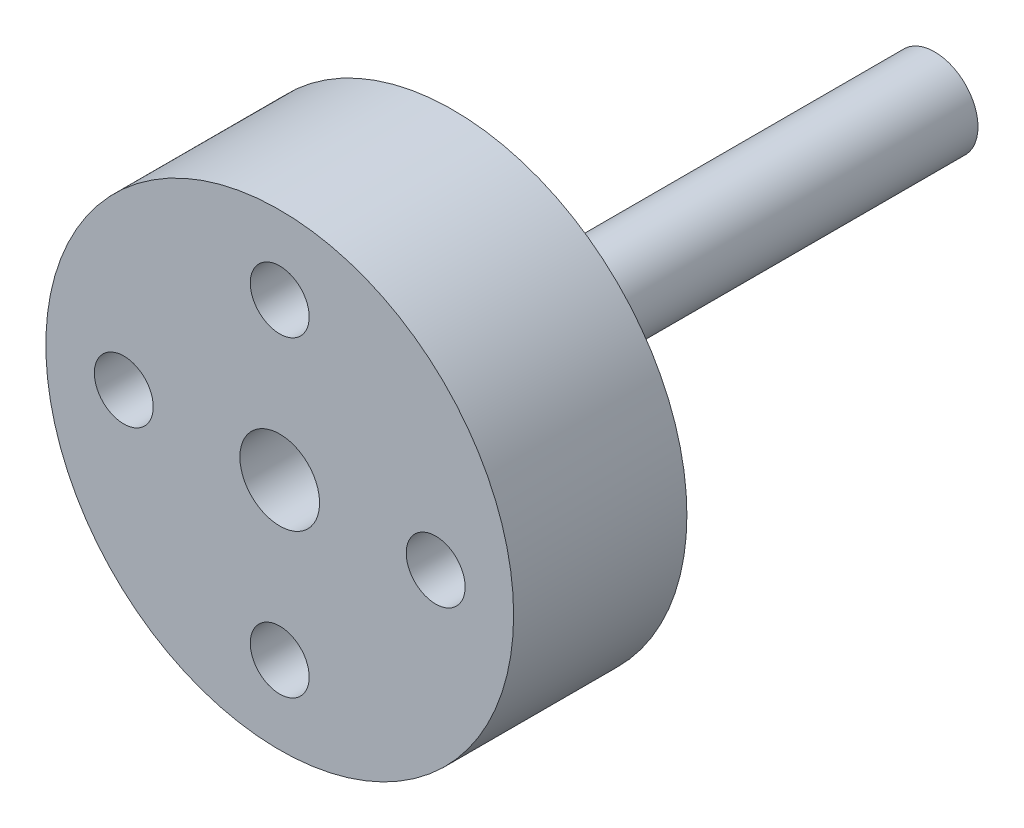
ISO-10303-21;
HEADER;
FILE_DESCRIPTION(('STEP AP214'),'2;1');
FILE_NAME('part.step','',(''),(''),'','','');
FILE_SCHEMA(('AUTOMOTIVE_DESIGN { 1 0 10303 214 1 1 1 1 }'));
ENDSEC;
DATA;
#1=APPLICATION_CONTEXT('core data for automotive mechanical design processes');
#2=APPLICATION_PROTOCOL_DEFINITION('international standard','automotive_design',2000,#1);
#3=PRODUCT_CONTEXT('',#1,'mechanical');
#4=PRODUCT('Part','Part','',(#3));
#5=PRODUCT_RELATED_PRODUCT_CATEGORY('part','',(#4));
#6=PRODUCT_DEFINITION_FORMATION('','',#4);
#7=PRODUCT_DEFINITION_CONTEXT('part definition',#1,'design');
#8=PRODUCT_DEFINITION('design','',#6,#7);
#9=PRODUCT_DEFINITION_SHAPE('','',#8);
#10=(LENGTH_UNIT() NAMED_UNIT(*) SI_UNIT(.MILLI.,.METRE.));
#11=(NAMED_UNIT(*) PLANE_ANGLE_UNIT() SI_UNIT($,.RADIAN.));
#12=(NAMED_UNIT(*) SI_UNIT($,.STERADIAN.) SOLID_ANGLE_UNIT());
#13=UNCERTAINTY_MEASURE_WITH_UNIT(LENGTH_MEASURE(1.E-05),#10,'distance_accuracy_value','');
#14=(GEOMETRIC_REPRESENTATION_CONTEXT(3) GLOBAL_UNCERTAINTY_ASSIGNED_CONTEXT((#13)) GLOBAL_UNIT_ASSIGNED_CONTEXT((#10,
#11,#12)) REPRESENTATION_CONTEXT('',''));
#15=CARTESIAN_POINT('',(0.,0.,0.));
#16=DIRECTION('',(0.,0.,1.));
#17=DIRECTION('',(1.,0.,0.));
#18=AXIS2_PLACEMENT_3D('',#15,#16,#17);
#19=CARTESIAN_POINT('',(0.,0.,0.));
#20=DIRECTION('',(0.,0.,-1.));
#21=DIRECTION('',(1.,0.,0.));
#22=AXIS2_PLACEMENT_3D('',#19,#20,#21);
#23=PLANE('',#22);
#24=CARTESIAN_POINT('',(9.,0.,0.));
#25=DIRECTION('',(0.,0.,1.));
#26=DIRECTION('',(1.,0.,0.));
#27=AXIS2_PLACEMENT_3D('',#24,#25,#26);
#28=CIRCLE('',#27,1.7);
#29=CARTESIAN_POINT('',(10.7,0.,0.));
#30=VERTEX_POINT('',#29);
#31=EDGE_CURVE('E81',#30,#30,#28,.F.);
#32=ORIENTED_EDGE('',*,*,#31,.T.);
#33=EDGE_LOOP('',(#32));
#34=FACE_BOUND('',#33,.T.);
#35=CARTESIAN_POINT('',(0.,0.,0.));
#36=DIRECTION('',(0.,0.,1.));
#37=DIRECTION('',(1.,0.,0.));
#38=AXIS2_PLACEMENT_3D('',#35,#36,#37);
#39=CIRCLE('',#38,13.5);
#40=CARTESIAN_POINT('',(13.5,0.,0.));
#41=VERTEX_POINT('',#40);
#42=EDGE_CURVE('E45',#41,#41,#39,.T.);
#43=ORIENTED_EDGE('',*,*,#42,.T.);
#44=EDGE_LOOP('',(#43));
#45=FACE_BOUND('',#44,.T.);
#46=CARTESIAN_POINT('',(0.,0.,0.));
#47=DIRECTION('',(0.,0.,-1.));
#48=DIRECTION('',(-1.,0.,0.));
#49=AXIS2_PLACEMENT_3D('',#46,#47,#48);
#50=CIRCLE('',#49,2.3);
#51=CARTESIAN_POINT('',(-2.3,0.,0.));
#52=VERTEX_POINT('',#51);
#53=EDGE_CURVE('E60',#52,#52,#50,.T.);
#54=ORIENTED_EDGE('',*,*,#53,.T.);
#55=EDGE_LOOP('',(#54));
#56=FACE_BOUND('',#55,.T.);
#57=CARTESIAN_POINT('',(0.,-9.,0.));
#58=DIRECTION('',(0.,0.,1.));
#59=DIRECTION('',(1.,0.,0.));
#60=AXIS2_PLACEMENT_3D('',#57,#58,#59);
#61=CIRCLE('',#60,1.7);
#62=CARTESIAN_POINT('',(1.7,-9.,0.));
#63=VERTEX_POINT('',#62);
#64=EDGE_CURVE('E63',#63,#63,#61,.F.);
#65=ORIENTED_EDGE('',*,*,#64,.T.);
#66=EDGE_LOOP('',(#65));
#67=FACE_BOUND('',#66,.T.);
#68=CARTESIAN_POINT('',(-9.,0.,0.));
#69=DIRECTION('',(0.,0.,1.));
#70=DIRECTION('',(1.,0.,0.));
#71=AXIS2_PLACEMENT_3D('',#68,#69,#70);
#72=CIRCLE('',#71,1.7);
#73=CARTESIAN_POINT('',(-7.3,0.,0.));
#74=VERTEX_POINT('',#73);
#75=EDGE_CURVE('E72',#74,#74,#72,.F.);
#76=ORIENTED_EDGE('',*,*,#75,.T.);
#77=EDGE_LOOP('',(#76));
#78=FACE_BOUND('',#77,.T.);
#79=CARTESIAN_POINT('',(0.,9.,0.));
#80=DIRECTION('',(0.,0.,1.));
#81=DIRECTION('',(1.,0.,0.));
#82=AXIS2_PLACEMENT_3D('',#79,#80,#81);
#83=CIRCLE('',#82,1.7);
#84=CARTESIAN_POINT('',(1.7,9.,0.));
#85=VERTEX_POINT('',#84);
#86=EDGE_CURVE('E90',#85,#85,#83,.F.);
#87=ORIENTED_EDGE('',*,*,#86,.T.);
#88=EDGE_LOOP('',(#87));
#89=FACE_BOUND('',#88,.T.);
#90=ADVANCED_FACE('F41',(#34,#45,#56,#67,#78,#89),#23,.F.);
#91=CARTESIAN_POINT('',(0.,0.,-10.));
#92=DIRECTION('',(0.,0.,1.));
#93=DIRECTION('',(-1.,0.,0.));
#94=AXIS2_PLACEMENT_3D('',#91,#92,#93);
#95=CYLINDRICAL_SURFACE('',#94,13.5);
#96=CARTESIAN_POINT('',(0.,0.,-10.));
#97=DIRECTION('',(0.,0.,1.));
#98=DIRECTION('',(1.,0.,0.));
#99=AXIS2_PLACEMENT_3D('',#96,#97,#98);
#100=CIRCLE('',#99,13.5);
#101=CARTESIAN_POINT('',(13.5,0.,-10.));
#102=VERTEX_POINT('',#101);
#103=EDGE_CURVE('E10',#102,#102,#100,.T.);
#104=ORIENTED_EDGE('',*,*,#103,.T.);
#105=EDGE_LOOP('',(#104));
#106=FACE_BOUND('',#105,.T.);
#107=ORIENTED_EDGE('',*,*,#42,.F.);
#108=EDGE_LOOP('',(#107));
#109=FACE_BOUND('',#108,.T.);
#110=ADVANCED_FACE('F43',(#106,#109),#95,.T.);
#111=CARTESIAN_POINT('',(0.,0.,-10.));
#112=DIRECTION('',(0.,0.,-1.));
#113=DIRECTION('',(1.,0.,0.));
#114=AXIS2_PLACEMENT_3D('',#111,#112,#113);
#115=PLANE('',#114);
#116=CARTESIAN_POINT('',(0.,9.,-10.));
#117=DIRECTION('',(0.,0.,1.));
#118=DIRECTION('',(1.,0.,0.));
#119=AXIS2_PLACEMENT_3D('',#116,#117,#118);
#120=CIRCLE('',#119,3.15);
#121=CARTESIAN_POINT('',(3.15,9.,-10.));
#122=VERTEX_POINT('',#121);
#123=EDGE_CURVE('E96',#122,#122,#120,.T.);
#124=ORIENTED_EDGE('',*,*,#123,.T.);
#125=EDGE_LOOP('',(#124));
#126=FACE_BOUND('',#125,.T.);
#127=CARTESIAN_POINT('',(9.,0.,-10.));
#128=DIRECTION('',(0.,0.,1.));
#129=DIRECTION('',(1.,0.,0.));
#130=AXIS2_PLACEMENT_3D('',#127,#128,#129);
#131=CIRCLE('',#130,3.15);
#132=CARTESIAN_POINT('',(12.15,0.,-10.));
#133=VERTEX_POINT('',#132);
#134=EDGE_CURVE('E87',#133,#133,#131,.T.);
#135=ORIENTED_EDGE('',*,*,#134,.T.);
#136=EDGE_LOOP('',(#135));
#137=FACE_BOUND('',#136,.T.);
#138=CARTESIAN_POINT('',(-9.,0.,-10.));
#139=DIRECTION('',(0.,0.,1.));
#140=DIRECTION('',(1.,0.,0.));
#141=AXIS2_PLACEMENT_3D('',#138,#139,#140);
#142=CIRCLE('',#141,3.15);
#143=CARTESIAN_POINT('',(-5.85,0.,-10.));
#144=VERTEX_POINT('',#143);
#145=EDGE_CURVE('E78',#144,#144,#142,.T.);
#146=ORIENTED_EDGE('',*,*,#145,.T.);
#147=EDGE_LOOP('',(#146));
#148=FACE_BOUND('',#147,.T.);
#149=CARTESIAN_POINT('',(0.,-9.,-10.));
#150=DIRECTION('',(0.,0.,1.));
#151=DIRECTION('',(1.,0.,0.));
#152=AXIS2_PLACEMENT_3D('',#149,#150,#151);
#153=CIRCLE('',#152,3.15);
#154=CARTESIAN_POINT('',(3.15,-9.,-10.));
#155=VERTEX_POINT('',#154);
#156=EDGE_CURVE('E69',#155,#155,#153,.T.);
#157=ORIENTED_EDGE('',*,*,#156,.T.);
#158=EDGE_LOOP('',(#157));
#159=FACE_BOUND('',#158,.T.);
#160=CARTESIAN_POINT('',(0.,0.,-10.));
#161=DIRECTION('',(0.,0.,1.));
#162=DIRECTION('',(1.,0.,0.));
#163=AXIS2_PLACEMENT_3D('',#160,#161,#162);
#164=CIRCLE('',#163,2.5);
#165=CARTESIAN_POINT('',(2.5,0.,-10.));
#166=VERTEX_POINT('',#165);
#167=EDGE_CURVE('E54',#166,#166,#164,.T.);
#168=ORIENTED_EDGE('',*,*,#167,.T.);
#169=EDGE_LOOP('',(#168));
#170=FACE_BOUND('',#169,.T.);
#171=ORIENTED_EDGE('',*,*,#103,.F.);
#172=EDGE_LOOP('',(#171));
#173=FACE_BOUND('',#172,.T.);
#174=ADVANCED_FACE('F116',(#126,#137,#148,#159,#170,#173),#115,.T.);
#175=CARTESIAN_POINT('',(0.,0.,-37.8));
#176=DIRECTION('',(0.,0.,1.));
#177=DIRECTION('',(-1.,0.,0.));
#178=AXIS2_PLACEMENT_3D('',#175,#176,#177);
#179=CYLINDRICAL_SURFACE('',#178,2.5);
#180=CARTESIAN_POINT('',(0.,0.,-37.8));
#181=DIRECTION('',(0.,0.,1.));
#182=DIRECTION('',(1.,0.,0.));
#183=AXIS2_PLACEMENT_3D('',#180,#181,#182);
#184=CIRCLE('',#183,2.5);
#185=CARTESIAN_POINT('',(2.5,0.,-37.8));
#186=VERTEX_POINT('',#185);
#187=EDGE_CURVE('E52',#186,#186,#184,.T.);
#188=ORIENTED_EDGE('',*,*,#187,.T.);
#189=EDGE_LOOP('',(#188));
#190=FACE_BOUND('',#189,.T.);
#191=ORIENTED_EDGE('',*,*,#167,.F.);
#192=EDGE_LOOP('',(#191));
#193=FACE_BOUND('',#192,.T.);
#194=ADVANCED_FACE('F119',(#190,#193),#179,.T.);
#195=CARTESIAN_POINT('',(0.,0.,-37.8));
#196=DIRECTION('',(0.,0.,-1.));
#197=DIRECTION('',(1.,0.,0.));
#198=AXIS2_PLACEMENT_3D('',#195,#196,#197);
#199=PLANE('',#198);
#200=ORIENTED_EDGE('',*,*,#187,.F.);
#201=EDGE_LOOP('',(#200));
#202=FACE_BOUND('',#201,.T.);
#203=ADVANCED_FACE('F131',(#202),#199,.T.);
#204=CARTESIAN_POINT('',(0.,0.,-6.));
#205=DIRECTION('',(0.,0.,1.));
#206=DIRECTION('',(-1.,0.,0.));
#207=AXIS2_PLACEMENT_3D('',#204,#205,#206);
#208=CYLINDRICAL_SURFACE('',#207,2.3);
#209=CARTESIAN_POINT('',(0.,0.,-6.));
#210=DIRECTION('',(0.,0.,-1.));
#211=DIRECTION('',(-1.,0.,0.));
#212=AXIS2_PLACEMENT_3D('',#209,#210,#211);
#213=CIRCLE('',#212,2.3);
#214=CARTESIAN_POINT('',(-2.3,0.,-6.));
#215=VERTEX_POINT('',#214);
#216=EDGE_CURVE('E57',#215,#215,#213,.T.);
#217=ORIENTED_EDGE('',*,*,#216,.T.);
#218=EDGE_LOOP('',(#217));
#219=FACE_BOUND('',#218,.T.);
#220=ORIENTED_EDGE('',*,*,#53,.F.);
#221=EDGE_LOOP('',(#220));
#222=FACE_BOUND('',#221,.T.);
#223=ADVANCED_FACE('F137',(#219,#222),#208,.F.);
#224=CARTESIAN_POINT('',(0.,0.,-6.));
#225=DIRECTION('',(0.,0.,1.));
#226=DIRECTION('',(-1.,0.,0.));
#227=AXIS2_PLACEMENT_3D('',#224,#225,#226);
#228=PLANE('',#227);
#229=ORIENTED_EDGE('',*,*,#216,.F.);
#230=EDGE_LOOP('',(#229));
#231=FACE_BOUND('',#230,.T.);
#232=ADVANCED_FACE('F180',(#231),#228,.T.);
#233=CARTESIAN_POINT('',(0.,-9.,-10.));
#234=DIRECTION('',(0.,0.,-1.));
#235=DIRECTION('',(1.,0.,0.));
#236=AXIS2_PLACEMENT_3D('',#233,#234,#235);
#237=CYLINDRICAL_SURFACE('',#236,1.7);
#238=ORIENTED_EDGE('',*,*,#64,.F.);
#239=EDGE_LOOP('',(#238));
#240=FACE_BOUND('',#239,.T.);
#241=CARTESIAN_POINT('',(0.,-9.,-8.55));
#242=DIRECTION('',(0.,0.,1.));
#243=DIRECTION('',(1.,0.,0.));
#244=AXIS2_PLACEMENT_3D('',#241,#242,#243);
#245=CIRCLE('',#244,1.7);
#246=CARTESIAN_POINT('',(1.7,-9.,-8.55));
#247=VERTEX_POINT('',#246);
#248=EDGE_CURVE('E66',#247,#247,#245,.T.);
#249=ORIENTED_EDGE('',*,*,#248,.F.);
#250=EDGE_LOOP('',(#249));
#251=FACE_BOUND('',#250,.T.);
#252=ADVANCED_FACE('F176',(#240,#251),#237,.F.);
#253=CARTESIAN_POINT('',(0.,-9.,-10.));
#254=DIRECTION('',(0.,0.,-1.));
#255=DIRECTION('',(1.,0.,0.));
#256=AXIS2_PLACEMENT_3D('',#253,#254,#255);
#257=CONICAL_SURFACE('',#256,3.15,0.785398163397448);
#258=ORIENTED_EDGE('',*,*,#248,.T.);
#259=EDGE_LOOP('',(#258));
#260=FACE_BOUND('',#259,.T.);
#261=ORIENTED_EDGE('',*,*,#156,.F.);
#262=EDGE_LOOP('',(#261));
#263=FACE_BOUND('',#262,.T.);
#264=ADVANCED_FACE('F159',(#260,#263),#257,.F.);
#265=CARTESIAN_POINT('',(-9.,0.,-10.));
#266=DIRECTION('',(0.,0.,-1.));
#267=DIRECTION('',(1.,0.,0.));
#268=AXIS2_PLACEMENT_3D('',#265,#266,#267);
#269=CYLINDRICAL_SURFACE('',#268,1.7);
#270=ORIENTED_EDGE('',*,*,#75,.F.);
#271=EDGE_LOOP('',(#270));
#272=FACE_BOUND('',#271,.T.);
#273=CARTESIAN_POINT('',(-9.,0.,-8.55));
#274=DIRECTION('',(0.,0.,1.));
#275=DIRECTION('',(1.,0.,0.));
#276=AXIS2_PLACEMENT_3D('',#273,#274,#275);
#277=CIRCLE('',#276,1.7);
#278=CARTESIAN_POINT('',(-7.3,0.,-8.55));
#279=VERTEX_POINT('',#278);
#280=EDGE_CURVE('E75',#279,#279,#277,.T.);
#281=ORIENTED_EDGE('',*,*,#280,.F.);
#282=EDGE_LOOP('',(#281));
#283=FACE_BOUND('',#282,.T.);
#284=ADVANCED_FACE('F155',(#272,#283),#269,.F.);
#285=CARTESIAN_POINT('',(-9.,0.,-10.));
#286=DIRECTION('',(0.,0.,-1.));
#287=DIRECTION('',(1.,0.,0.));
#288=AXIS2_PLACEMENT_3D('',#285,#286,#287);
#289=CONICAL_SURFACE('',#288,3.15,0.785398163397448);
#290=ORIENTED_EDGE('',*,*,#280,.T.);
#291=EDGE_LOOP('',(#290));
#292=FACE_BOUND('',#291,.T.);
#293=ORIENTED_EDGE('',*,*,#145,.F.);
#294=EDGE_LOOP('',(#293));
#295=FACE_BOUND('',#294,.T.);
#296=ADVANCED_FACE('F158',(#292,#295),#289,.F.);
#297=CARTESIAN_POINT('',(9.,0.,-10.));
#298=DIRECTION('',(0.,0.,-1.));
#299=DIRECTION('',(1.,0.,0.));
#300=AXIS2_PLACEMENT_3D('',#297,#298,#299);
#301=CYLINDRICAL_SURFACE('',#300,1.7);
#302=ORIENTED_EDGE('',*,*,#31,.F.);
#303=EDGE_LOOP('',(#302));
#304=FACE_BOUND('',#303,.T.);
#305=CARTESIAN_POINT('',(9.,0.,-8.55));
#306=DIRECTION('',(0.,0.,1.));
#307=DIRECTION('',(1.,0.,0.));
#308=AXIS2_PLACEMENT_3D('',#305,#306,#307);
#309=CIRCLE('',#308,1.7);
#310=CARTESIAN_POINT('',(10.7,0.,-8.55));
#311=VERTEX_POINT('',#310);
#312=EDGE_CURVE('E84',#311,#311,#309,.T.);
#313=ORIENTED_EDGE('',*,*,#312,.F.);
#314=EDGE_LOOP('',(#313));
#315=FACE_BOUND('',#314,.T.);
#316=ADVANCED_FACE('F165',(#304,#315),#301,.F.);
#317=CARTESIAN_POINT('',(9.,0.,-10.));
#318=DIRECTION('',(0.,0.,-1.));
#319=DIRECTION('',(1.,0.,0.));
#320=AXIS2_PLACEMENT_3D('',#317,#318,#319);
#321=CONICAL_SURFACE('',#320,3.15,0.785398163397448);
#322=ORIENTED_EDGE('',*,*,#312,.T.);
#323=EDGE_LOOP('',(#322));
#324=FACE_BOUND('',#323,.T.);
#325=ORIENTED_EDGE('',*,*,#134,.F.);
#326=EDGE_LOOP('',(#325));
#327=FACE_BOUND('',#326,.T.);
#328=ADVANCED_FACE('F107',(#324,#327),#321,.F.);
#329=CARTESIAN_POINT('',(0.,9.,-10.));
#330=DIRECTION('',(0.,0.,-1.));
#331=DIRECTION('',(1.,0.,0.));
#332=AXIS2_PLACEMENT_3D('',#329,#330,#331);
#333=CYLINDRICAL_SURFACE('',#332,1.7);
#334=ORIENTED_EDGE('',*,*,#86,.F.);
#335=EDGE_LOOP('',(#334));
#336=FACE_BOUND('',#335,.T.);
#337=CARTESIAN_POINT('',(0.,9.,-8.55));
#338=DIRECTION('',(0.,0.,1.));
#339=DIRECTION('',(1.,0.,0.));
#340=AXIS2_PLACEMENT_3D('',#337,#338,#339);
#341=CIRCLE('',#340,1.7);
#342=CARTESIAN_POINT('',(1.7,9.,-8.55));
#343=VERTEX_POINT('',#342);
#344=EDGE_CURVE('E93',#343,#343,#341,.T.);
#345=ORIENTED_EDGE('',*,*,#344,.F.);
#346=EDGE_LOOP('',(#345));
#347=FACE_BOUND('',#346,.T.);
#348=ADVANCED_FACE('F103',(#336,#347),#333,.F.);
#349=CARTESIAN_POINT('',(0.,9.,-10.));
#350=DIRECTION('',(0.,0.,-1.));
#351=DIRECTION('',(1.,0.,0.));
#352=AXIS2_PLACEMENT_3D('',#349,#350,#351);
#353=CONICAL_SURFACE('',#352,3.15,0.785398163397448);
#354=ORIENTED_EDGE('',*,*,#344,.T.);
#355=EDGE_LOOP('',(#354));
#356=FACE_BOUND('',#355,.T.);
#357=ORIENTED_EDGE('',*,*,#123,.F.);
#358=EDGE_LOOP('',(#357));
#359=FACE_BOUND('',#358,.T.);
#360=ADVANCED_FACE('F106',(#356,#359),#353,.F.);
#361=CLOSED_SHELL('',(#90,#110,#174,#194,#203,#223,#232,#252,#264,#284,#296,#316,#328,#348,#360));
#362=MANIFOLD_SOLID_BREP('B2',#361);
#363=ADVANCED_BREP_SHAPE_REPRESENTATION('',(#18,#362),#14);
#364=SHAPE_DEFINITION_REPRESENTATION(#9,#363);
ENDSEC;
END-ISO-10303-21;
